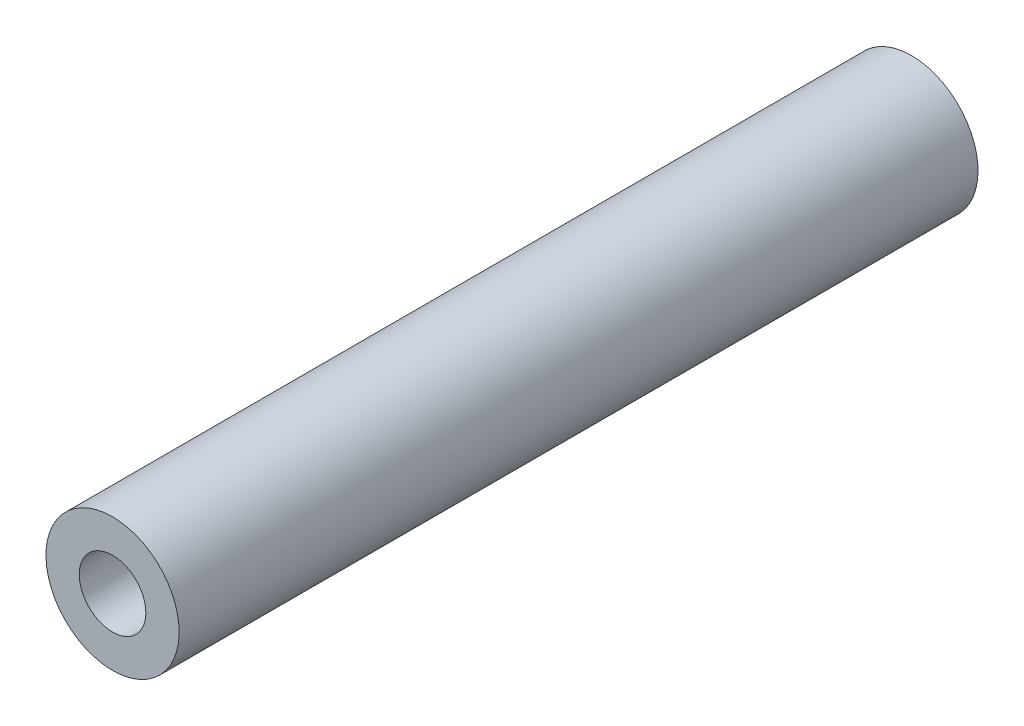
ISO-10303-21;
HEADER;
FILE_DESCRIPTION(('STEP AP214'),'2;1');
FILE_NAME('part.step','',(''),(''),'','','');
FILE_SCHEMA(('AUTOMOTIVE_DESIGN { 1 0 10303 214 1 1 1 1 }'));
ENDSEC;
DATA;
#1=APPLICATION_CONTEXT('core data for automotive mechanical design processes');
#2=APPLICATION_PROTOCOL_DEFINITION('international standard','automotive_design',2000,#1);
#3=PRODUCT_CONTEXT('',#1,'mechanical');
#4=PRODUCT('Part','Part','',(#3));
#5=PRODUCT_RELATED_PRODUCT_CATEGORY('part','',(#4));
#6=PRODUCT_DEFINITION_FORMATION('','',#4);
#7=PRODUCT_DEFINITION_CONTEXT('part definition',#1,'design');
#8=PRODUCT_DEFINITION('design','',#6,#7);
#9=PRODUCT_DEFINITION_SHAPE('','',#8);
#10=(LENGTH_UNIT() NAMED_UNIT(*) SI_UNIT(.MILLI.,.METRE.));
#11=(NAMED_UNIT(*) PLANE_ANGLE_UNIT() SI_UNIT($,.RADIAN.));
#12=(NAMED_UNIT(*) SI_UNIT($,.STERADIAN.) SOLID_ANGLE_UNIT());
#13=UNCERTAINTY_MEASURE_WITH_UNIT(LENGTH_MEASURE(1.E-05),#10,'distance_accuracy_value','');
#14=(GEOMETRIC_REPRESENTATION_CONTEXT(3) GLOBAL_UNCERTAINTY_ASSIGNED_CONTEXT((#13)) GLOBAL_UNIT_ASSIGNED_CONTEXT((#10,
#11,#12)) REPRESENTATION_CONTEXT('',''));
#15=CARTESIAN_POINT('',(0.,0.,0.));
#16=DIRECTION('',(0.,0.,1.));
#17=DIRECTION('',(1.,0.,0.));
#18=AXIS2_PLACEMENT_3D('',#15,#16,#17);
#19=CARTESIAN_POINT('',(0.,-5.,28.));
#20=DIRECTION('',(0.,0.,-1.));
#21=DIRECTION('',(0.,1.,0.));
#22=AXIS2_PLACEMENT_3D('',#19,#20,#21);
#23=CYLINDRICAL_SURFACE('',#22,2.);
#24=CARTESIAN_POINT('',(0.,-5.,28.));
#25=DIRECTION('',(0.,0.,-1.));
#26=DIRECTION('',(0.,1.,0.));
#27=AXIS2_PLACEMENT_3D('',#24,#25,#26);
#28=CIRCLE('',#27,2.);
#29=CARTESIAN_POINT('',(0.,-3.,28.));
#30=VERTEX_POINT('',#29);
#31=EDGE_CURVE('E19',#30,#30,#28,.T.);
#32=ORIENTED_EDGE('',*,*,#31,.T.);
#33=EDGE_LOOP('',(#32));
#34=FACE_BOUND('',#33,.T.);
#35=CARTESIAN_POINT('',(0.,-5.00000000000002,4.));
#36=DIRECTION('',(0.,0.,-1.));
#37=DIRECTION('',(0.,1.,0.));
#38=AXIS2_PLACEMENT_3D('',#35,#36,#37);
#39=CIRCLE('',#38,2.);
#40=CARTESIAN_POINT('',(0.,-3.00000000000002,3.99999999999999));
#41=VERTEX_POINT('',#40);
#42=EDGE_CURVE('E28',#41,#41,#39,.T.);
#43=ORIENTED_EDGE('',*,*,#42,.F.);
#44=EDGE_LOOP('',(#43));
#45=FACE_BOUND('',#44,.T.);
#46=ADVANCED_FACE('F15',(#34,#45),#23,.T.);
#47=CARTESIAN_POINT('',(2.024,-7.024,28.));
#48=DIRECTION('',(0.,0.,-1.));
#49=DIRECTION('',(-1.,0.,0.));
#50=AXIS2_PLACEMENT_3D('',#47,#48,#49);
#51=PLANE('',#50);
#52=CARTESIAN_POINT('',(0.,-5.,28.));
#53=DIRECTION('',(0.,0.,-1.));
#54=DIRECTION('',(0.,1.,0.));
#55=AXIS2_PLACEMENT_3D('',#52,#53,#54);
#56=CIRCLE('',#55,1.);
#57=CARTESIAN_POINT('',(0.,-4.,28.));
#58=VERTEX_POINT('',#57);
#59=EDGE_CURVE('E23',#58,#58,#56,.F.);
#60=ORIENTED_EDGE('',*,*,#59,.F.);
#61=EDGE_LOOP('',(#60));
#62=FACE_BOUND('',#61,.T.);
#63=ORIENTED_EDGE('',*,*,#31,.F.);
#64=EDGE_LOOP('',(#63));
#65=FACE_BOUND('',#64,.T.);
#66=ADVANCED_FACE('F38',(#62,#65),#51,.F.);
#67=CARTESIAN_POINT('',(2.024,-7.024,4.));
#68=DIRECTION('',(0.,0.,-1.));
#69=DIRECTION('',(-1.,0.,0.));
#70=AXIS2_PLACEMENT_3D('',#67,#68,#69);
#71=PLANE('',#70);
#72=CARTESIAN_POINT('',(0.,-5.00000000000004,4.));
#73=DIRECTION('',(0.,0.,-1.));
#74=DIRECTION('',(0.,1.,0.));
#75=AXIS2_PLACEMENT_3D('',#72,#73,#74);
#76=CIRCLE('',#75,1.);
#77=CARTESIAN_POINT('',(0.,-4.00000000000004,3.99999999999999));
#78=VERTEX_POINT('',#77);
#79=EDGE_CURVE('E10',#78,#78,#76,.T.);
#80=ORIENTED_EDGE('',*,*,#79,.F.);
#81=EDGE_LOOP('',(#80));
#82=FACE_BOUND('',#81,.T.);
#83=ORIENTED_EDGE('',*,*,#42,.T.);
#84=EDGE_LOOP('',(#83));
#85=FACE_BOUND('',#84,.T.);
#86=ADVANCED_FACE('F17',(#82,#85),#71,.T.);
#87=CARTESIAN_POINT('',(0.,-5.,28.));
#88=DIRECTION('',(0.,0.,-1.));
#89=DIRECTION('',(0.,1.,0.));
#90=AXIS2_PLACEMENT_3D('',#87,#88,#89);
#91=CYLINDRICAL_SURFACE('',#90,1.);
#92=ORIENTED_EDGE('',*,*,#79,.T.);
#93=EDGE_LOOP('',(#92));
#94=FACE_BOUND('',#93,.T.);
#95=ORIENTED_EDGE('',*,*,#59,.T.);
#96=EDGE_LOOP('',(#95));
#97=FACE_BOUND('',#96,.T.);
#98=ADVANCED_FACE('F46',(#94,#97),#91,.F.);
#99=CLOSED_SHELL('',(#46,#66,#86,#98));
#100=MANIFOLD_SOLID_BREP('B1',#99);
#101=ADVANCED_BREP_SHAPE_REPRESENTATION('',(#18,#100),#14);
#102=SHAPE_DEFINITION_REPRESENTATION(#9,#101);
ENDSEC;
END-ISO-10303-21;
